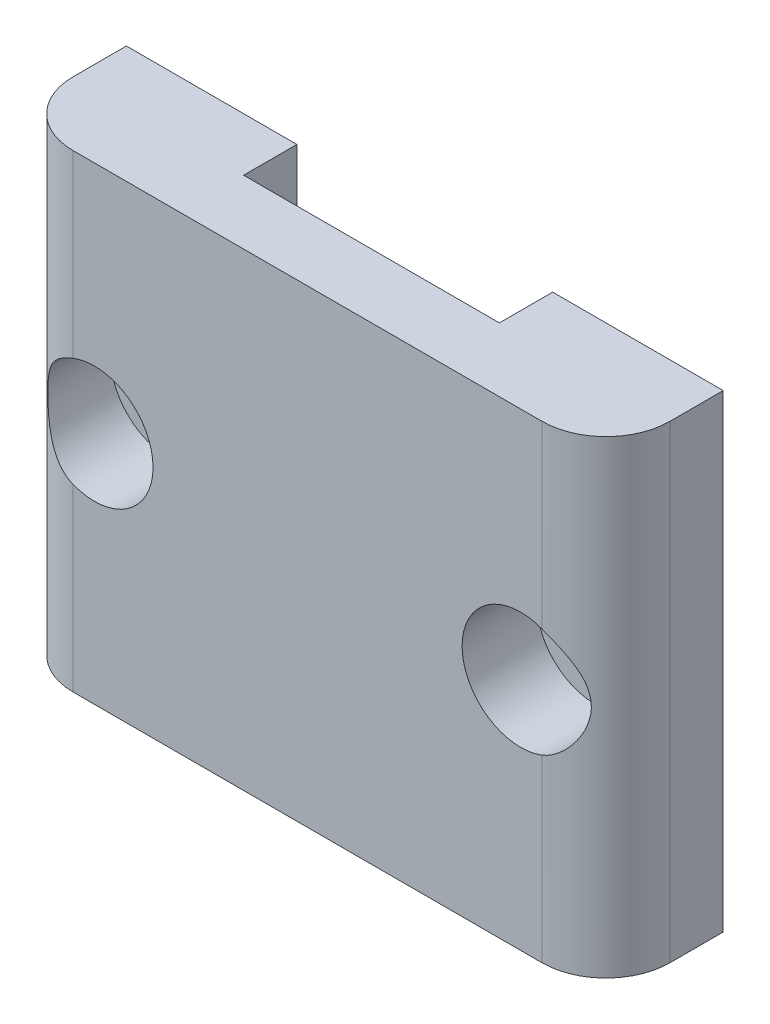
ISO-10303-21;
HEADER;
FILE_DESCRIPTION(('STEP AP214'),'2;1');
FILE_NAME('part.step','',(''),(''),'','','');
FILE_SCHEMA(('AUTOMOTIVE_DESIGN { 1 0 10303 214 1 1 1 1 }'));
ENDSEC;
DATA;
#1=APPLICATION_CONTEXT('core data for automotive mechanical design processes');
#2=APPLICATION_PROTOCOL_DEFINITION('international standard','automotive_design',2000,#1);
#3=PRODUCT_CONTEXT('',#1,'mechanical');
#4=PRODUCT('Part','Part','',(#3));
#5=PRODUCT_RELATED_PRODUCT_CATEGORY('part','',(#4));
#6=PRODUCT_DEFINITION_FORMATION('','',#4);
#7=PRODUCT_DEFINITION_CONTEXT('part definition',#1,'design');
#8=PRODUCT_DEFINITION('design','',#6,#7);
#9=PRODUCT_DEFINITION_SHAPE('','',#8);
#10=(LENGTH_UNIT() NAMED_UNIT(*) SI_UNIT(.MILLI.,.METRE.));
#11=(NAMED_UNIT(*) PLANE_ANGLE_UNIT() SI_UNIT($,.RADIAN.));
#12=(NAMED_UNIT(*) SI_UNIT($,.STERADIAN.) SOLID_ANGLE_UNIT());
#13=UNCERTAINTY_MEASURE_WITH_UNIT(LENGTH_MEASURE(1.E-05),#10,'distance_accuracy_value','');
#14=(GEOMETRIC_REPRESENTATION_CONTEXT(3) GLOBAL_UNCERTAINTY_ASSIGNED_CONTEXT((#13)) GLOBAL_UNIT_ASSIGNED_CONTEXT((#10,
#11,#12)) REPRESENTATION_CONTEXT('',''));
#15=CARTESIAN_POINT('',(0.,0.,0.));
#16=DIRECTION('',(0.,0.,1.));
#17=DIRECTION('',(1.,0.,0.));
#18=AXIS2_PLACEMENT_3D('',#15,#16,#17);
#19=CARTESIAN_POINT('',(-9.99999999999999,0.,0.));
#20=DIRECTION('',(0.,0.,-1.));
#21=DIRECTION('',(-1.,0.,0.));
#22=AXIS2_PLACEMENT_3D('',#19,#20,#21);
#23=CYLINDRICAL_SURFACE('',#22,1.6);
#24=CARTESIAN_POINT('',(-9.99999999999999,0.,-5.5));
#25=DIRECTION('',(0.,0.,1.));
#26=DIRECTION('',(1.,0.,0.));
#27=AXIS2_PLACEMENT_3D('',#24,#25,#26);
#28=CIRCLE('',#27,1.6);
#29=CARTESIAN_POINT('',(-8.4,0.,-5.5));
#30=VERTEX_POINT('',#29);
#31=EDGE_CURVE('E209',#30,#30,#28,.T.);
#32=ORIENTED_EDGE('',*,*,#31,.F.);
#33=EDGE_LOOP('',(#32));
#34=FACE_BOUND('',#33,.T.);
#35=CARTESIAN_POINT('',(-9.99999999999999,0.,-3.5));
#36=DIRECTION('',(0.,0.,1.));
#37=DIRECTION('',(1.,0.,0.));
#38=AXIS2_PLACEMENT_3D('',#35,#36,#37);
#39=CIRCLE('',#38,1.6);
#40=CARTESIAN_POINT('',(-8.4,0.,-3.5));
#41=VERTEX_POINT('',#40);
#42=EDGE_CURVE('E205',#41,#41,#39,.T.);
#43=ORIENTED_EDGE('',*,*,#42,.T.);
#44=EDGE_LOOP('',(#43));
#45=FACE_BOUND('',#44,.T.);
#46=ADVANCED_FACE('F45',(#34,#45),#23,.F.);
#47=CARTESIAN_POINT('',(9.99999999999999,0.,0.));
#48=DIRECTION('',(0.,0.,-1.));
#49=DIRECTION('',(-1.,0.,0.));
#50=AXIS2_PLACEMENT_3D('',#47,#48,#49);
#51=CYLINDRICAL_SURFACE('',#50,1.6);
#52=CARTESIAN_POINT('',(9.99999999999999,0.,-5.5));
#53=DIRECTION('',(0.,0.,-1.));
#54=DIRECTION('',(-1.,0.,0.));
#55=AXIS2_PLACEMENT_3D('',#52,#53,#54);
#56=CIRCLE('',#55,1.6);
#57=CARTESIAN_POINT('',(8.4,0.,-5.5));
#58=VERTEX_POINT('',#57);
#59=EDGE_CURVE('E281',#58,#58,#56,.T.);
#60=ORIENTED_EDGE('',*,*,#59,.T.);
#61=EDGE_LOOP('',(#60));
#62=FACE_BOUND('',#61,.T.);
#63=CARTESIAN_POINT('',(9.99999999999999,0.,-3.5));
#64=DIRECTION('',(0.,0.,1.));
#65=DIRECTION('',(1.,0.,0.));
#66=AXIS2_PLACEMENT_3D('',#63,#64,#65);
#67=CIRCLE('',#66,1.6);
#68=CARTESIAN_POINT('',(11.6,0.,-3.5));
#69=VERTEX_POINT('',#68);
#70=EDGE_CURVE('E202',#69,#69,#67,.F.);
#71=ORIENTED_EDGE('',*,*,#70,.F.);
#72=EDGE_LOOP('',(#71));
#73=FACE_BOUND('',#72,.T.);
#74=ADVANCED_FACE('F311',(#62,#73),#51,.F.);
#75=CARTESIAN_POINT('',(0.,0.,0.));
#76=DIRECTION('',(0.,0.,1.));
#77=DIRECTION('',(1.,0.,0.));
#78=AXIS2_PLACEMENT_3D('',#75,#76,#77);
#79=PLANE('',#78);
#80=DIRECTION('',(-1.,0.,0.));
#81=VECTOR('',#80,1.);
#82=CARTESIAN_POINT('',(14.,11.,0.));
#83=LINE('',#82,#81);
#84=CARTESIAN_POINT('',(11.,11.,0.));
#85=VERTEX_POINT('',#84);
#86=CARTESIAN_POINT('',(-11.,11.,0.));
#87=VERTEX_POINT('',#86);
#88=EDGE_CURVE('E186',#85,#87,#83,.T.);
#89=ORIENTED_EDGE('',*,*,#88,.T.);
#90=DIRECTION('',(0.,-1.,0.));
#91=VECTOR('',#90,1.);
#92=CARTESIAN_POINT('',(-11.,0.,0.));
#93=LINE('',#92,#91);
#94=CARTESIAN_POINT('',(-11.,2.5617376914899,0.));
#95=VERTEX_POINT('',#94);
#96=EDGE_CURVE('E216',#87,#95,#93,.T.);
#97=ORIENTED_EDGE('',*,*,#96,.T.);
#98=CARTESIAN_POINT('',(-9.99999999999999,0.,0.));
#99=DIRECTION('',(0.,0.,1.));
#100=DIRECTION('',(1.,0.,0.));
#101=AXIS2_PLACEMENT_3D('',#98,#99,#100);
#102=CIRCLE('',#101,2.75);
#103=CARTESIAN_POINT('',(-11.,-2.5617376914899,0.));
#104=VERTEX_POINT('',#103);
#105=EDGE_CURVE('E272',#104,#95,#102,.T.);
#106=ORIENTED_EDGE('',*,*,#105,.F.);
#107=DIRECTION('',(0.,-1.,0.));
#108=VECTOR('',#107,1.);
#109=CARTESIAN_POINT('',(-11.,0.,0.));
#110=LINE('',#109,#108);
#111=CARTESIAN_POINT('',(-11.,-11.,0.));
#112=VERTEX_POINT('',#111);
#113=EDGE_CURVE('E214',#104,#112,#110,.T.);
#114=ORIENTED_EDGE('',*,*,#113,.T.);
#115=DIRECTION('',(1.,0.,0.));
#116=VECTOR('',#115,1.);
#117=CARTESIAN_POINT('',(14.,-11.,0.));
#118=LINE('',#117,#116);
#119=CARTESIAN_POINT('',(11.,-11.,0.));
#120=VERTEX_POINT('',#119);
#121=EDGE_CURVE('E183',#112,#120,#118,.T.);
#122=ORIENTED_EDGE('',*,*,#121,.T.);
#123=DIRECTION('',(0.,1.,0.));
#124=VECTOR('',#123,1.);
#125=CARTESIAN_POINT('',(11.,0.,0.));
#126=LINE('',#125,#124);
#127=CARTESIAN_POINT('',(11.,-2.5617376914899,0.));
#128=VERTEX_POINT('',#127);
#129=EDGE_CURVE('E211',#120,#128,#126,.T.);
#130=ORIENTED_EDGE('',*,*,#129,.T.);
#131=CARTESIAN_POINT('',(9.99999999999999,0.,0.));
#132=DIRECTION('',(0.,0.,1.));
#133=DIRECTION('',(1.,0.,0.));
#134=AXIS2_PLACEMENT_3D('',#131,#132,#133);
#135=CIRCLE('',#134,2.75);
#136=CARTESIAN_POINT('',(11.,2.5617376914899,0.));
#137=VERTEX_POINT('',#136);
#138=EDGE_CURVE('E271',#137,#128,#135,.T.);
#139=ORIENTED_EDGE('',*,*,#138,.F.);
#140=DIRECTION('',(0.,1.,0.));
#141=VECTOR('',#140,1.);
#142=CARTESIAN_POINT('',(11.,0.,0.));
#143=LINE('',#142,#141);
#144=EDGE_CURVE('E195',#137,#85,#143,.T.);
#145=ORIENTED_EDGE('',*,*,#144,.T.);
#146=EDGE_LOOP('',(#89,#97,#106,#114,#122,#130,#139,#145));
#147=FACE_BOUND('',#146,.T.);
#148=ADVANCED_FACE('F264',(#147),#79,.T.);
#149=CARTESIAN_POINT('',(0.,0.,-3.));
#150=DIRECTION('',(0.,0.,1.));
#151=DIRECTION('',(1.,0.,0.));
#152=AXIS2_PLACEMENT_3D('',#149,#150,#151);
#153=PLANE('',#152);
#154=DIRECTION('',(0.,-1.,0.));
#155=VECTOR('',#154,1.);
#156=CARTESIAN_POINT('',(-6.,0.,-3.));
#157=LINE('',#156,#155);
#158=CARTESIAN_POINT('',(-6.,11.,-3.));
#159=VERTEX_POINT('',#158);
#160=CARTESIAN_POINT('',(-6.,-11.,-3.));
#161=VERTEX_POINT('',#160);
#162=EDGE_CURVE('E154',#159,#161,#157,.T.);
#163=ORIENTED_EDGE('',*,*,#162,.F.);
#164=DIRECTION('',(-1.,0.,0.));
#165=VECTOR('',#164,1.);
#166=CARTESIAN_POINT('',(14.,11.,-3.));
#167=LINE('',#166,#165);
#168=CARTESIAN_POINT('',(6.,11.,-3.));
#169=VERTEX_POINT('',#168);
#170=EDGE_CURVE('E159',#169,#159,#167,.T.);
#171=ORIENTED_EDGE('',*,*,#170,.F.);
#172=DIRECTION('',(0.,-1.,0.));
#173=VECTOR('',#172,1.);
#174=CARTESIAN_POINT('',(6.,0.,-3.));
#175=LINE('',#174,#173);
#176=CARTESIAN_POINT('',(6.00000000000001,-11.,-3.));
#177=VERTEX_POINT('',#176);
#178=EDGE_CURVE('E160',#169,#177,#175,.T.);
#179=ORIENTED_EDGE('',*,*,#178,.T.);
#180=DIRECTION('',(1.,0.,0.));
#181=VECTOR('',#180,1.);
#182=CARTESIAN_POINT('',(14.,-11.,-3.));
#183=LINE('',#182,#181);
#184=EDGE_CURVE('E184',#161,#177,#183,.T.);
#185=ORIENTED_EDGE('',*,*,#184,.F.);
#186=EDGE_LOOP('',(#163,#171,#179,#185));
#187=FACE_BOUND('',#186,.T.);
#188=ADVANCED_FACE('F290',(#187),#153,.F.);
#189=CARTESIAN_POINT('',(-14.,-11.,-3.));
#190=DIRECTION('',(-1.,0.,0.));
#191=DIRECTION('',(0.,0.,1.));
#192=AXIS2_PLACEMENT_3D('',#189,#190,#191);
#193=PLANE('',#192);
#194=DIRECTION('',(0.,0.,1.));
#195=VECTOR('',#194,1.);
#196=CARTESIAN_POINT('',(-14.,-11.,-3.));
#197=LINE('',#196,#195);
#198=CARTESIAN_POINT('',(-14.,-11.,-5.5));
#199=VERTEX_POINT('',#198);
#200=CARTESIAN_POINT('',(-14.,-11.,-3.));
#201=VERTEX_POINT('',#200);
#202=EDGE_CURVE('E188',#199,#201,#197,.T.);
#203=ORIENTED_EDGE('',*,*,#202,.T.);
#204=DIRECTION('',(0.,-1.,0.));
#205=VECTOR('',#204,1.);
#206=CARTESIAN_POINT('',(-14.,-11.,-3.));
#207=LINE('',#206,#205);
#208=CARTESIAN_POINT('',(-14.,11.,-3.));
#209=VERTEX_POINT('',#208);
#210=EDGE_CURVE('E69',#201,#209,#207,.F.);
#211=ORIENTED_EDGE('',*,*,#210,.T.);
#212=DIRECTION('',(0.,0.,1.));
#213=VECTOR('',#212,1.);
#214=CARTESIAN_POINT('',(-14.,11.,-3.));
#215=LINE('',#214,#213);
#216=CARTESIAN_POINT('',(-14.,11.,-5.5));
#217=VERTEX_POINT('',#216);
#218=EDGE_CURVE('E193',#217,#209,#215,.T.);
#219=ORIENTED_EDGE('',*,*,#218,.F.);
#220=DIRECTION('',(0.,1.,0.));
#221=VECTOR('',#220,1.);
#222=CARTESIAN_POINT('',(-14.,0.,-5.5));
#223=LINE('',#222,#221);
#224=EDGE_CURVE('E153',#199,#217,#223,.T.);
#225=ORIENTED_EDGE('',*,*,#224,.F.);
#226=EDGE_LOOP('',(#203,#211,#219,#225));
#227=FACE_BOUND('',#226,.T.);
#228=ADVANCED_FACE('F308',(#227),#193,.T.);
#229=CARTESIAN_POINT('',(14.,11.,-3.));
#230=DIRECTION('',(0.,1.,0.));
#231=DIRECTION('',(0.,0.,1.));
#232=AXIS2_PLACEMENT_3D('',#229,#230,#231);
#233=PLANE('',#232);
#234=ORIENTED_EDGE('',*,*,#218,.T.);
#235=CARTESIAN_POINT('',(-11.,11.,-3.));
#236=DIRECTION('',(0.,1.,0.));
#237=DIRECTION('',(0.,0.,1.));
#238=AXIS2_PLACEMENT_3D('',#235,#236,#237);
#239=CIRCLE('',#238,3.);
#240=EDGE_CURVE('E250',#209,#87,#239,.T.);
#241=ORIENTED_EDGE('',*,*,#240,.T.);
#242=ORIENTED_EDGE('',*,*,#88,.F.);
#243=CARTESIAN_POINT('',(11.,11.,-3.));
#244=DIRECTION('',(0.,1.,0.));
#245=DIRECTION('',(0.,0.,1.));
#246=AXIS2_PLACEMENT_3D('',#243,#244,#245);
#247=CIRCLE('',#246,3.);
#248=CARTESIAN_POINT('',(14.,11.,-3.));
#249=VERTEX_POINT('',#248);
#250=EDGE_CURVE('E61',#85,#249,#247,.T.);
#251=ORIENTED_EDGE('',*,*,#250,.T.);
#252=DIRECTION('',(0.,0.,1.));
#253=VECTOR('',#252,1.);
#254=CARTESIAN_POINT('',(14.,11.,-3.));
#255=LINE('',#254,#253);
#256=CARTESIAN_POINT('',(14.,11.,-5.5));
#257=VERTEX_POINT('',#256);
#258=EDGE_CURVE('E196',#257,#249,#255,.T.);
#259=ORIENTED_EDGE('',*,*,#258,.F.);
#260=DIRECTION('',(1.,0.,0.));
#261=VECTOR('',#260,1.);
#262=CARTESIAN_POINT('',(0.,11.,-5.5));
#263=LINE('',#262,#261);
#264=CARTESIAN_POINT('',(6.,11.,-5.5));
#265=VERTEX_POINT('',#264);
#266=EDGE_CURVE('E170',#265,#257,#263,.T.);
#267=ORIENTED_EDGE('',*,*,#266,.F.);
#268=DIRECTION('',(0.,0.,1.));
#269=VECTOR('',#268,1.);
#270=CARTESIAN_POINT('',(6.,11.,-5.5));
#271=LINE('',#270,#269);
#272=EDGE_CURVE('E181',#265,#169,#271,.T.);
#273=ORIENTED_EDGE('',*,*,#272,.T.);
#274=ORIENTED_EDGE('',*,*,#170,.T.);
#275=DIRECTION('',(0.,0.,1.));
#276=VECTOR('',#275,1.);
#277=CARTESIAN_POINT('',(-6.,11.,-5.5));
#278=LINE('',#277,#276);
#279=CARTESIAN_POINT('',(-6.,11.,-5.5));
#280=VERTEX_POINT('',#279);
#281=EDGE_CURVE('E139',#280,#159,#278,.T.);
#282=ORIENTED_EDGE('',*,*,#281,.F.);
#283=DIRECTION('',(1.,0.,0.));
#284=VECTOR('',#283,1.);
#285=CARTESIAN_POINT('',(0.,11.,-5.5));
#286=LINE('',#285,#284);
#287=EDGE_CURVE('E147',#217,#280,#286,.T.);
#288=ORIENTED_EDGE('',*,*,#287,.F.);
#289=EDGE_LOOP('',(#234,#241,#242,#251,#259,#267,#273,#274,#282,#288));
#290=FACE_BOUND('',#289,.T.);
#291=ADVANCED_FACE('F157',(#290),#233,.T.);
#292=CARTESIAN_POINT('',(14.,-11.,-3.));
#293=DIRECTION('',(1.,0.,0.));
#294=DIRECTION('',(0.,0.,-1.));
#295=AXIS2_PLACEMENT_3D('',#292,#293,#294);
#296=PLANE('',#295);
#297=ORIENTED_EDGE('',*,*,#258,.T.);
#298=DIRECTION('',(0.,1.,0.));
#299=VECTOR('',#298,1.);
#300=CARTESIAN_POINT('',(14.,-11.,-3.));
#301=LINE('',#300,#299);
#302=CARTESIAN_POINT('',(14.,-11.,-3.));
#303=VERTEX_POINT('',#302);
#304=EDGE_CURVE('E11',#249,#303,#301,.F.);
#305=ORIENTED_EDGE('',*,*,#304,.T.);
#306=DIRECTION('',(0.,0.,1.));
#307=VECTOR('',#306,1.);
#308=CARTESIAN_POINT('',(14.,-11.,-3.));
#309=LINE('',#308,#307);
#310=CARTESIAN_POINT('',(14.,-11.,-5.5));
#311=VERTEX_POINT('',#310);
#312=EDGE_CURVE('E198',#311,#303,#309,.T.);
#313=ORIENTED_EDGE('',*,*,#312,.F.);
#314=DIRECTION('',(0.,-1.,0.));
#315=VECTOR('',#314,1.);
#316=CARTESIAN_POINT('',(14.,0.,-5.5));
#317=LINE('',#316,#315);
#318=EDGE_CURVE('E173',#257,#311,#317,.T.);
#319=ORIENTED_EDGE('',*,*,#318,.F.);
#320=EDGE_LOOP('',(#297,#305,#313,#319));
#321=FACE_BOUND('',#320,.T.);
#322=ADVANCED_FACE('F300',(#321),#296,.T.);
#323=CARTESIAN_POINT('',(14.,-11.,-3.));
#324=DIRECTION('',(0.,-1.,0.));
#325=DIRECTION('',(0.,0.,-1.));
#326=AXIS2_PLACEMENT_3D('',#323,#324,#325);
#327=PLANE('',#326);
#328=ORIENTED_EDGE('',*,*,#121,.F.);
#329=CARTESIAN_POINT('',(-11.,-11.,-3.));
#330=DIRECTION('',(0.,-1.,0.));
#331=DIRECTION('',(0.,0.,-1.));
#332=AXIS2_PLACEMENT_3D('',#329,#330,#331);
#333=CIRCLE('',#332,3.);
#334=EDGE_CURVE('E253',#112,#201,#333,.T.);
#335=ORIENTED_EDGE('',*,*,#334,.T.);
#336=ORIENTED_EDGE('',*,*,#202,.F.);
#337=DIRECTION('',(-1.,0.,0.));
#338=VECTOR('',#337,1.);
#339=CARTESIAN_POINT('',(0.,-11.,-5.5));
#340=LINE('',#339,#338);
#341=CARTESIAN_POINT('',(-6.,-11.,-5.5));
#342=VERTEX_POINT('',#341);
#343=EDGE_CURVE('E146',#342,#199,#340,.T.);
#344=ORIENTED_EDGE('',*,*,#343,.F.);
#345=DIRECTION('',(0.,0.,1.));
#346=VECTOR('',#345,1.);
#347=CARTESIAN_POINT('',(-6.,-11.,-5.5));
#348=LINE('',#347,#346);
#349=EDGE_CURVE('E142',#342,#161,#348,.T.);
#350=ORIENTED_EDGE('',*,*,#349,.T.);
#351=ORIENTED_EDGE('',*,*,#184,.T.);
#352=DIRECTION('',(0.,0.,1.));
#353=VECTOR('',#352,1.);
#354=CARTESIAN_POINT('',(6.,-11.,-5.5));
#355=LINE('',#354,#353);
#356=CARTESIAN_POINT('',(6.,-11.,-5.5));
#357=VERTEX_POINT('',#356);
#358=EDGE_CURVE('E177',#357,#177,#355,.T.);
#359=ORIENTED_EDGE('',*,*,#358,.F.);
#360=DIRECTION('',(-1.,0.,0.));
#361=VECTOR('',#360,1.);
#362=CARTESIAN_POINT('',(0.,-11.,-5.5));
#363=LINE('',#362,#361);
#364=EDGE_CURVE('E176',#311,#357,#363,.T.);
#365=ORIENTED_EDGE('',*,*,#364,.F.);
#366=ORIENTED_EDGE('',*,*,#312,.T.);
#367=CARTESIAN_POINT('',(11.,-11.,-3.));
#368=DIRECTION('',(0.,-1.,0.));
#369=DIRECTION('',(0.,0.,-1.));
#370=AXIS2_PLACEMENT_3D('',#367,#368,#369);
#371=CIRCLE('',#370,3.);
#372=EDGE_CURVE('E226',#303,#120,#371,.T.);
#373=ORIENTED_EDGE('',*,*,#372,.T.);
#374=EDGE_LOOP('',(#328,#335,#336,#344,#350,#351,#359,#365,#366,#373));
#375=FACE_BOUND('',#374,.T.);
#376=ADVANCED_FACE('F258',(#375),#327,.T.);
#377=CARTESIAN_POINT('',(6.,0.,-5.5));
#378=DIRECTION('',(-1.,0.,0.));
#379=DIRECTION('',(0.,-1.,0.));
#380=AXIS2_PLACEMENT_3D('',#377,#378,#379);
#381=PLANE('',#380);
#382=ORIENTED_EDGE('',*,*,#178,.F.);
#383=ORIENTED_EDGE('',*,*,#272,.F.);
#384=DIRECTION('',(0.,-1.,0.));
#385=VECTOR('',#384,1.);
#386=CARTESIAN_POINT('',(6.,0.,-5.5));
#387=LINE('',#386,#385);
#388=EDGE_CURVE('E163',#265,#357,#387,.T.);
#389=ORIENTED_EDGE('',*,*,#388,.T.);
#390=ORIENTED_EDGE('',*,*,#358,.T.);
#391=EDGE_LOOP('',(#382,#383,#389,#390));
#392=FACE_BOUND('',#391,.T.);
#393=ADVANCED_FACE('F293',(#392),#381,.T.);
#394=CARTESIAN_POINT('',(0.,0.,-5.5));
#395=DIRECTION('',(0.,0.,-1.));
#396=DIRECTION('',(-1.,0.,0.));
#397=AXIS2_PLACEMENT_3D('',#394,#395,#396);
#398=PLANE('',#397);
#399=ORIENTED_EDGE('',*,*,#59,.F.);
#400=EDGE_LOOP('',(#399));
#401=FACE_BOUND('',#400,.T.);
#402=ORIENTED_EDGE('',*,*,#388,.F.);
#403=ORIENTED_EDGE('',*,*,#266,.T.);
#404=ORIENTED_EDGE('',*,*,#318,.T.);
#405=ORIENTED_EDGE('',*,*,#364,.T.);
#406=EDGE_LOOP('',(#402,#403,#404,#405));
#407=FACE_BOUND('',#406,.T.);
#408=ADVANCED_FACE('F297',(#401,#407),#398,.T.);
#409=CARTESIAN_POINT('',(-6.,0.,-5.5));
#410=DIRECTION('',(-1.,0.,0.));
#411=DIRECTION('',(0.,-1.,0.));
#412=AXIS2_PLACEMENT_3D('',#409,#410,#411);
#413=PLANE('',#412);
#414=ORIENTED_EDGE('',*,*,#162,.T.);
#415=ORIENTED_EDGE('',*,*,#349,.F.);
#416=DIRECTION('',(0.,-1.,0.));
#417=VECTOR('',#416,1.);
#418=CARTESIAN_POINT('',(-6.,0.,-5.5));
#419=LINE('',#418,#417);
#420=EDGE_CURVE('E135',#280,#342,#419,.T.);
#421=ORIENTED_EDGE('',*,*,#420,.F.);
#422=ORIENTED_EDGE('',*,*,#281,.T.);
#423=EDGE_LOOP('',(#414,#415,#421,#422));
#424=FACE_BOUND('',#423,.T.);
#425=ADVANCED_FACE('F137',(#424),#413,.F.);
#426=CARTESIAN_POINT('',(0.,0.,-5.5));
#427=DIRECTION('',(0.,0.,-1.));
#428=DIRECTION('',(-1.,0.,0.));
#429=AXIS2_PLACEMENT_3D('',#426,#427,#428);
#430=PLANE('',#429);
#431=ORIENTED_EDGE('',*,*,#31,.T.);
#432=EDGE_LOOP('',(#431));
#433=FACE_BOUND('',#432,.T.);
#434=ORIENTED_EDGE('',*,*,#287,.T.);
#435=ORIENTED_EDGE('',*,*,#420,.T.);
#436=ORIENTED_EDGE('',*,*,#343,.T.);
#437=ORIENTED_EDGE('',*,*,#224,.T.);
#438=EDGE_LOOP('',(#434,#435,#436,#437));
#439=FACE_BOUND('',#438,.T.);
#440=ADVANCED_FACE('F151',(#433,#439),#430,.T.);
#441=CARTESIAN_POINT('',(9.99999999999999,0.,-3.5));
#442=DIRECTION('',(0.,0.,1.));
#443=DIRECTION('',(1.,0.,0.));
#444=AXIS2_PLACEMENT_3D('',#441,#442,#443);
#445=PLANE('',#444);
#446=CARTESIAN_POINT('',(9.99999999999999,0.,-3.5));
#447=DIRECTION('',(0.,0.,1.));
#448=DIRECTION('',(1.,0.,0.));
#449=AXIS2_PLACEMENT_3D('',#446,#447,#448);
#450=CIRCLE('',#449,2.75);
#451=CARTESIAN_POINT('',(12.75,0.,-3.5));
#452=VERTEX_POINT('',#451);
#453=EDGE_CURVE('E273',#452,#452,#450,.T.);
#454=ORIENTED_EDGE('',*,*,#453,.T.);
#455=EDGE_LOOP('',(#454));
#456=FACE_BOUND('',#455,.T.);
#457=ORIENTED_EDGE('',*,*,#70,.T.);
#458=EDGE_LOOP('',(#457));
#459=FACE_BOUND('',#458,.T.);
#460=ADVANCED_FACE('F242',(#456,#459),#445,.T.);
#461=CARTESIAN_POINT('',(9.99999999999999,0.,-3.5));
#462=DIRECTION('',(0.,0.,1.));
#463=DIRECTION('',(1.,0.,0.));
#464=AXIS2_PLACEMENT_3D('',#461,#462,#463);
#465=CYLINDRICAL_SURFACE('',#464,2.75);
#466=ORIENTED_EDGE('',*,*,#453,.F.);
#467=EDGE_LOOP('',(#466));
#468=FACE_BOUND('',#467,.T.);
#469=ORIENTED_EDGE('',*,*,#138,.T.);
#470=CARTESIAN_POINT('',(11.,-2.5617376914899,0.));
#471=CARTESIAN_POINT('',(11.0665072545233,-2.53579214681082,1.24927336351205E-05));
#472=CARTESIAN_POINT('',(11.1319587364073,-2.50724289981398,-0.00221083082247264));
#473=CARTESIAN_POINT('',(11.2601703715193,-2.44530375774031,-0.0106166458658224));
#474=CARTESIAN_POINT('',(11.3229337841127,-2.41191995317049,-0.0167941888833675));
#475=CARTESIAN_POINT('',(11.4448702273161,-2.34089617753259,-0.0325355003261922));
#476=CARTESIAN_POINT('',(11.5040678879215,-2.30329225134196,-0.0420718861952332));
#477=CARTESIAN_POINT('',(11.6190732751205,-2.22395738591967,-0.063985975423783));
#478=CARTESIAN_POINT('',(11.6748799942836,-2.18222522979688,-0.07636451800364));
#479=CARTESIAN_POINT('',(11.8362685684384,-2.05174846891736,-0.116791032930279));
#480=CARTESIAN_POINT('',(11.9364972770122,-1.9573247381256,-0.148229081426994));
#481=CARTESIAN_POINT('',(12.1213350474818,-1.75535586237322,-0.21569725300632));
#482=CARTESIAN_POINT('',(12.2058969413439,-1.64777266216104,-0.251740708322438));
#483=CARTESIAN_POINT('',(12.3678370271691,-1.40693731913914,-0.32829603919058));
#484=CARTESIAN_POINT('',(12.4429665288112,-1.27215893318197,-0.368798541457201));
#485=CARTESIAN_POINT('',(12.5701039073086,-0.990389412549825,-0.442617216855181));
#486=CARTESIAN_POINT('',(12.6221500154576,-0.84341895366555,-0.475945225080314));
#487=CARTESIAN_POINT('',(12.6936734109345,-0.568267177543517,-0.523516251972255));
#488=CARTESIAN_POINT('',(12.717383254368,-0.441609668879182,-0.540143555045526));
#489=CARTESIAN_POINT('',(12.7467751077978,-0.185266297918769,-0.560917091857263));
#490=CARTESIAN_POINT('',(12.7524774101,-0.05558401038006,-0.565077374139642));
#491=CARTESIAN_POINT('',(12.7455447474116,0.203070847267824,-0.560105605824151));
#492=CARTESIAN_POINT('',(12.7329010694193,0.332043050932945,-0.550967239332682));
#493=CARTESIAN_POINT('',(12.6899941835998,0.585675391563454,-0.521174398516637));
#494=CARTESIAN_POINT('',(12.6597140740933,0.710331270451237,-0.500508878076485));
#495=CARTESIAN_POINT('',(12.5819612804264,0.955456368591483,-0.450576279376964));
#496=CARTESIAN_POINT('',(12.5341168543353,1.07576813345818,-0.421126012498415));
#497=CARTESIAN_POINT('',(12.4226021187242,1.30770350968779,-0.357972445624313));
#498=CARTESIAN_POINT('',(12.3589138706014,1.4193170834212,-0.324264346291216));
#499=CARTESIAN_POINT('',(12.202819229814,1.6533383049508,-0.250078472022683));
#500=CARTESIAN_POINT('',(12.107237534696,1.77363154398272,-0.2095575266603));
#501=CARTESIAN_POINT('',(11.8963843823529,1.99744413715915,-0.134870061332356));
#502=CARTESIAN_POINT('',(11.7811586059933,2.10100134526374,-0.100689174624464));
#503=CARTESIAN_POINT('',(11.5578320545766,2.26959753780247,-0.0505700930523488));
#504=CARTESIAN_POINT('',(11.452957304878,2.33819463856164,-0.032345724691644));
#505=CARTESIAN_POINT('',(11.288353698546,2.43035761225974,-0.0133743856530167));
#506=CARTESIAN_POINT('',(11.2320972132946,2.45935799473938,-0.00844278402406128));
#507=CARTESIAN_POINT('',(11.1175094111647,2.51350322662332,-0.00175127366133376));
#508=CARTESIAN_POINT('',(11.0591760472759,2.53864413475497,5.41232502369976E-06));
#509=CARTESIAN_POINT('',(11.,2.5617376914899,0.));
#510=B_SPLINE_CURVE_WITH_KNOTS('',3,(#470,#471,#472,#473,#474,#475,#476,#477,#478,#479,#480,
#481,#482,#483,#484,#485,#486,#487,#488,#489,#490,#491,#492,#493,#494,#495,#496,#497,#498,#499,
#500,#501,#502,#503,#504,#505,#506,#507,#508,#509),.UNSPECIFIED.,.F.,.F.,(4,2,2,2,2,2,2,2,2,2,2,
2,2,2,2,2,2,2,2,4),(0.,0.214022556249504,0.427777798295804,0.639829292266963,0.85194348063807,
1.2738212131535,1.6969491535038,2.17340664569175,2.64907204306196,3.03714525821235,
3.42478100577125,3.81260091228651,4.20079309467933,4.59772544523591,4.99510927014323,
5.4696804577431,5.94316275366981,6.32143991451234,6.5116821393101,6.70211736420619),.UNSPECIFIED.);
#511=EDGE_CURVE('E54',#128,#137,#510,.T.);
#512=ORIENTED_EDGE('',*,*,#511,.T.);
#513=EDGE_LOOP('',(#469,#512));
#514=FACE_BOUND('',#513,.T.);
#515=ADVANCED_FACE('F237',(#468,#514),#465,.F.);
#516=CARTESIAN_POINT('',(-9.99999999999999,0.,-3.5));
#517=DIRECTION('',(0.,0.,1.));
#518=DIRECTION('',(1.,0.,0.));
#519=AXIS2_PLACEMENT_3D('',#516,#517,#518);
#520=CYLINDRICAL_SURFACE('',#519,2.75);
#521=CARTESIAN_POINT('',(-9.99999999999999,0.,-3.5));
#522=DIRECTION('',(0.,0.,1.));
#523=DIRECTION('',(1.,0.,0.));
#524=AXIS2_PLACEMENT_3D('',#521,#522,#523);
#525=CIRCLE('',#524,2.75);
#526=CARTESIAN_POINT('',(-7.25,0.,-3.5));
#527=VERTEX_POINT('',#526);
#528=EDGE_CURVE('E206',#527,#527,#525,.T.);
#529=ORIENTED_EDGE('',*,*,#528,.F.);
#530=EDGE_LOOP('',(#529));
#531=FACE_BOUND('',#530,.T.);
#532=ORIENTED_EDGE('',*,*,#105,.T.);
#533=CARTESIAN_POINT('',(-11.,2.5617376914899,0.));
#534=CARTESIAN_POINT('',(-11.0665072545233,2.53579214681082,1.24927336354323E-05));
#535=CARTESIAN_POINT('',(-11.1319587364073,2.50724289981398,-0.00221083082247237));
#536=CARTESIAN_POINT('',(-11.2601703715193,2.44530375774031,-0.0106166458658224));
#537=CARTESIAN_POINT('',(-11.3229337841127,2.41191995317049,-0.0167941888833677));
#538=CARTESIAN_POINT('',(-11.4448702273161,2.34089617753259,-0.0325355003261925));
#539=CARTESIAN_POINT('',(-11.5040678879215,2.30329225134196,-0.0420718861952335));
#540=CARTESIAN_POINT('',(-11.6190732751205,2.22395738591966,-0.0639859754237836));
#541=CARTESIAN_POINT('',(-11.6748799942837,2.18222522979688,-0.0763645180036408));
#542=CARTESIAN_POINT('',(-11.8362685684385,2.05174846891735,-0.11679103293028));
#543=CARTESIAN_POINT('',(-11.9364972770122,1.95732473812559,-0.148229081426994));
#544=CARTESIAN_POINT('',(-12.1213350474818,1.75535586237322,-0.215697253006319));
#545=CARTESIAN_POINT('',(-12.2058969413439,1.64777266216104,-0.251740708322437));
#546=CARTESIAN_POINT('',(-12.3678370271691,1.40693731913913,-0.32829603919058));
#547=CARTESIAN_POINT('',(-12.4429665288112,1.27215893318196,-0.3687985414572));
#548=CARTESIAN_POINT('',(-12.5701039073086,0.990389412549816,-0.44261721685518));
#549=CARTESIAN_POINT('',(-12.6221500154576,0.843418953665541,-0.475945225080312));
#550=CARTESIAN_POINT('',(-12.6936734109345,0.568267177543507,-0.523516251972253));
#551=CARTESIAN_POINT('',(-12.717383254368,0.441609668879172,-0.540143555045524));
#552=CARTESIAN_POINT('',(-12.7467751077978,0.185266297918759,-0.56091709185726));
#553=CARTESIAN_POINT('',(-12.7524774101,0.0555840103800497,-0.565077374139638));
#554=CARTESIAN_POINT('',(-12.7455447474116,-0.203070847267834,-0.560105605824146));
#555=CARTESIAN_POINT('',(-12.7329010694193,-0.332043050932955,-0.550967239332678));
#556=CARTESIAN_POINT('',(-12.6899941835998,-0.585675391563464,-0.521174398516632));
#557=CARTESIAN_POINT('',(-12.6597140740933,-0.710331270451247,-0.500508878076481));
#558=CARTESIAN_POINT('',(-12.5819612804264,-0.955456368591492,-0.450576279376959));
#559=CARTESIAN_POINT('',(-12.5341168543353,-1.07576813345819,-0.421126012498409));
#560=CARTESIAN_POINT('',(-12.4226021187242,-1.3077035096878,-0.357972445624307));
#561=CARTESIAN_POINT('',(-12.3589138706013,-1.41931708342121,-0.32426434629121));
#562=CARTESIAN_POINT('',(-12.202819229814,-1.65333830495082,-0.250078472022678));
#563=CARTESIAN_POINT('',(-12.107237534696,-1.77363154398273,-0.209557526660295));
#564=CARTESIAN_POINT('',(-11.8963843823529,-1.99744413715916,-0.134870061332351));
#565=CARTESIAN_POINT('',(-11.7811586059933,-2.10100134526375,-0.100689174624459));
#566=CARTESIAN_POINT('',(-11.5578320545765,-2.26959753780248,-0.0505700930523457));
#567=CARTESIAN_POINT('',(-11.452957304878,-2.33819463856165,-0.0323457246916422));
#568=CARTESIAN_POINT('',(-11.288353698546,-2.43035761225974,-0.0133743856530161));
#569=CARTESIAN_POINT('',(-11.2320972132946,-2.45935799473938,-0.00844278402406101));
#570=CARTESIAN_POINT('',(-11.1175094111647,-2.51350322662332,-0.00175127366133378));
#571=CARTESIAN_POINT('',(-11.0591760472759,-2.53864413475497,5.41232502366223E-06));
#572=CARTESIAN_POINT('',(-11.,-2.5617376914899,0.));
#573=B_SPLINE_CURVE_WITH_KNOTS('',3,(#533,#534,#535,#536,#537,#538,#539,#540,#541,#542,#543,
#544,#545,#546,#547,#548,#549,#550,#551,#552,#553,#554,#555,#556,#557,#558,#559,#560,#561,#562,
#563,#564,#565,#566,#567,#568,#569,#570,#571,#572),.UNSPECIFIED.,.F.,.F.,(4,2,2,2,2,2,2,2,2,2,2,
2,2,2,2,2,2,2,2,4),(0.,0.214022556249505,0.427777798295805,0.639829292266966,0.851943480638071,
1.2738212131535,1.6969491535038,2.17340664569175,2.64907204306196,3.03714525821236,
3.42478100577125,3.81260091228652,4.20079309467933,4.59772544523591,4.99510927014324,
5.46968045774311,5.94316275366982,6.32143991451234,6.5116821393101,6.70211736420618),.UNSPECIFIED.);
#574=EDGE_CURVE('E219',#95,#104,#573,.T.);
#575=ORIENTED_EDGE('',*,*,#574,.T.);
#576=EDGE_LOOP('',(#532,#575));
#577=FACE_BOUND('',#576,.T.);
#578=ADVANCED_FACE('F231',(#531,#577),#520,.F.);
#579=CARTESIAN_POINT('',(-9.99999999999999,0.,-3.5));
#580=DIRECTION('',(0.,0.,1.));
#581=DIRECTION('',(1.,0.,0.));
#582=AXIS2_PLACEMENT_3D('',#579,#580,#581);
#583=PLANE('',#582);
#584=ORIENTED_EDGE('',*,*,#42,.F.);
#585=EDGE_LOOP('',(#584));
#586=FACE_BOUND('',#585,.T.);
#587=ORIENTED_EDGE('',*,*,#528,.T.);
#588=EDGE_LOOP('',(#587));
#589=FACE_BOUND('',#588,.T.);
#590=ADVANCED_FACE('F236',(#586,#589),#583,.T.);
#591=CARTESIAN_POINT('',(-11.,0.,-3.));
#592=DIRECTION('',(0.,-1.,0.));
#593=DIRECTION('',(0.,0.,-1.));
#594=AXIS2_PLACEMENT_3D('',#591,#592,#593);
#595=CYLINDRICAL_SURFACE('',#594,3.);
#596=ORIENTED_EDGE('',*,*,#240,.F.);
#597=ORIENTED_EDGE('',*,*,#210,.F.);
#598=ORIENTED_EDGE('',*,*,#334,.F.);
#599=ORIENTED_EDGE('',*,*,#113,.F.);
#600=ORIENTED_EDGE('',*,*,#574,.F.);
#601=ORIENTED_EDGE('',*,*,#96,.F.);
#602=EDGE_LOOP('',(#596,#597,#598,#599,#600,#601));
#603=FACE_BOUND('',#602,.T.);
#604=ADVANCED_FACE('F228',(#603),#595,.T.);
#605=CARTESIAN_POINT('',(11.,0.,-3.));
#606=DIRECTION('',(0.,1.,0.));
#607=DIRECTION('',(0.,0.,1.));
#608=AXIS2_PLACEMENT_3D('',#605,#606,#607);
#609=CYLINDRICAL_SURFACE('',#608,3.);
#610=ORIENTED_EDGE('',*,*,#372,.F.);
#611=ORIENTED_EDGE('',*,*,#304,.F.);
#612=ORIENTED_EDGE('',*,*,#250,.F.);
#613=ORIENTED_EDGE('',*,*,#144,.F.);
#614=ORIENTED_EDGE('',*,*,#511,.F.);
#615=ORIENTED_EDGE('',*,*,#129,.F.);
#616=EDGE_LOOP('',(#610,#611,#612,#613,#614,#615));
#617=FACE_BOUND('',#616,.T.);
#618=ADVANCED_FACE('F47',(#617),#609,.T.);
#619=CLOSED_SHELL('',(#46,#74,#148,#188,#228,#291,#322,#376,#393,#408,#425,#440,#460,#515,#578,
#590,#604,#618));
#620=MANIFOLD_SOLID_BREP('B2',#619);
#621=ADVANCED_BREP_SHAPE_REPRESENTATION('',(#18,#620),#14);
#622=SHAPE_DEFINITION_REPRESENTATION(#9,#621);
ENDSEC;
END-ISO-10303-21;
